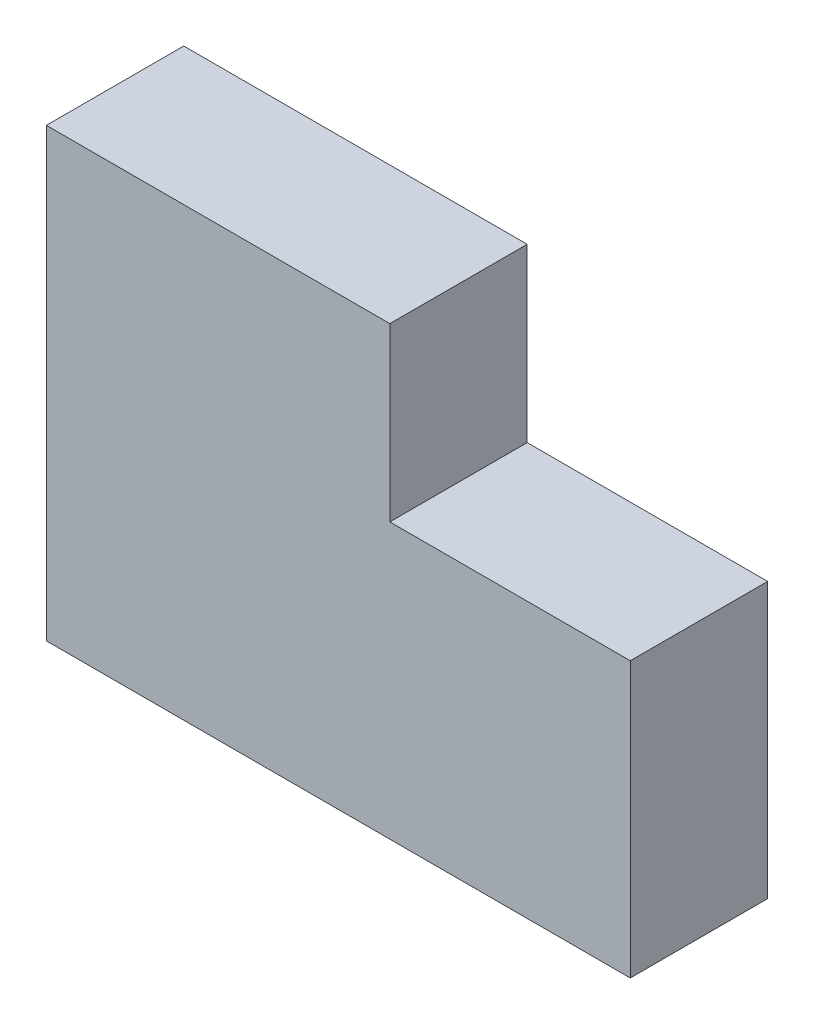
ISO-10303-21;
HEADER;
FILE_DESCRIPTION(('STEP AP214'),'2;1');
FILE_NAME('part.step','',(''),(''),'','','');
FILE_SCHEMA(('AUTOMOTIVE_DESIGN { 1 0 10303 214 1 1 1 1 }'));
ENDSEC;
DATA;
#1=APPLICATION_CONTEXT('core data for automotive mechanical design processes');
#2=APPLICATION_PROTOCOL_DEFINITION('international standard','automotive_design',2000,#1);
#3=PRODUCT_CONTEXT('',#1,'mechanical');
#4=PRODUCT('Part','Part','',(#3));
#5=PRODUCT_RELATED_PRODUCT_CATEGORY('part','',(#4));
#6=PRODUCT_DEFINITION_FORMATION('','',#4);
#7=PRODUCT_DEFINITION_CONTEXT('part definition',#1,'design');
#8=PRODUCT_DEFINITION('design','',#6,#7);
#9=PRODUCT_DEFINITION_SHAPE('','',#8);
#10=(LENGTH_UNIT() NAMED_UNIT(*) SI_UNIT(.MILLI.,.METRE.));
#11=(NAMED_UNIT(*) PLANE_ANGLE_UNIT() SI_UNIT($,.RADIAN.));
#12=(NAMED_UNIT(*) SI_UNIT($,.STERADIAN.) SOLID_ANGLE_UNIT());
#13=UNCERTAINTY_MEASURE_WITH_UNIT(LENGTH_MEASURE(1.E-05),#10,'distance_accuracy_value','');
#14=(GEOMETRIC_REPRESENTATION_CONTEXT(3) GLOBAL_UNCERTAINTY_ASSIGNED_CONTEXT((#13)) GLOBAL_UNIT_ASSIGNED_CONTEXT((#10,
#11,#12)) REPRESENTATION_CONTEXT('',''));
#15=CARTESIAN_POINT('',(0.,0.,0.));
#16=DIRECTION('',(0.,0.,1.));
#17=DIRECTION('',(1.,0.,0.));
#18=AXIS2_PLACEMENT_3D('',#15,#16,#17);
#19=CARTESIAN_POINT('',(85.,0.,-20.));
#20=DIRECTION('',(0.,-1.,0.));
#21=DIRECTION('',(0.,0.,-1.));
#22=AXIS2_PLACEMENT_3D('',#19,#20,#21);
#23=PLANE('',#22);
#24=DIRECTION('',(1.,0.,0.));
#25=VECTOR('',#24,1.);
#26=CARTESIAN_POINT('',(85.,0.,0.));
#27=LINE('',#26,#25);
#28=CARTESIAN_POINT('',(0.,0.,0.));
#29=VERTEX_POINT('',#28);
#30=CARTESIAN_POINT('',(85.,0.,0.));
#31=VERTEX_POINT('',#30);
#32=EDGE_CURVE('E130',#29,#31,#27,.T.);
#33=ORIENTED_EDGE('',*,*,#32,.F.);
#34=DIRECTION('',(0.,0.,1.));
#35=VECTOR('',#34,1.);
#36=CARTESIAN_POINT('',(0.,0.,-20.));
#37=LINE('',#36,#35);
#38=CARTESIAN_POINT('',(0.,0.,-20.));
#39=VERTEX_POINT('',#38);
#40=EDGE_CURVE('E11',#39,#29,#37,.T.);
#41=ORIENTED_EDGE('',*,*,#40,.F.);
#42=DIRECTION('',(1.,0.,0.));
#43=VECTOR('',#42,1.);
#44=CARTESIAN_POINT('',(85.,0.,-20.));
#45=LINE('',#44,#43);
#46=CARTESIAN_POINT('',(85.,0.,-20.));
#47=VERTEX_POINT('',#46);
#48=EDGE_CURVE('E150',#39,#47,#45,.T.);
#49=ORIENTED_EDGE('',*,*,#48,.T.);
#50=DIRECTION('',(0.,0.,1.));
#51=VECTOR('',#50,1.);
#52=CARTESIAN_POINT('',(85.,0.,-20.));
#53=LINE('',#52,#51);
#54=EDGE_CURVE('E42',#47,#31,#53,.T.);
#55=ORIENTED_EDGE('',*,*,#54,.T.);
#56=EDGE_LOOP('',(#33,#41,#49,#55));
#57=FACE_BOUND('',#56,.T.);
#58=ADVANCED_FACE('F39',(#57),#23,.T.);
#59=CARTESIAN_POINT('',(0.,0.,-20.));
#60=DIRECTION('',(-1.,0.,0.));
#61=DIRECTION('',(0.,0.,1.));
#62=AXIS2_PLACEMENT_3D('',#59,#60,#61);
#63=PLANE('',#62);
#64=DIRECTION('',(0.,-1.,0.));
#65=VECTOR('',#64,1.);
#66=CARTESIAN_POINT('',(0.,0.,0.));
#67=LINE('',#66,#65);
#68=CARTESIAN_POINT('',(0.,65.,0.));
#69=VERTEX_POINT('',#68);
#70=EDGE_CURVE('E147',#69,#29,#67,.T.);
#71=ORIENTED_EDGE('',*,*,#70,.F.);
#72=DIRECTION('',(0.,0.,1.));
#73=VECTOR('',#72,1.);
#74=CARTESIAN_POINT('',(0.,65.,-20.));
#75=LINE('',#74,#73);
#76=CARTESIAN_POINT('',(0.,65.,-20.));
#77=VERTEX_POINT('',#76);
#78=EDGE_CURVE('E49',#77,#69,#75,.T.);
#79=ORIENTED_EDGE('',*,*,#78,.F.);
#80=DIRECTION('',(0.,-1.,0.));
#81=VECTOR('',#80,1.);
#82=CARTESIAN_POINT('',(0.,0.,-20.));
#83=LINE('',#82,#81);
#84=EDGE_CURVE('E116',#77,#39,#83,.T.);
#85=ORIENTED_EDGE('',*,*,#84,.T.);
#86=ORIENTED_EDGE('',*,*,#40,.T.);
#87=EDGE_LOOP('',(#71,#79,#85,#86));
#88=FACE_BOUND('',#87,.T.);
#89=ADVANCED_FACE('F162',(#88),#63,.T.);
#90=CARTESIAN_POINT('',(0.,65.,-20.));
#91=DIRECTION('',(0.,1.,0.));
#92=DIRECTION('',(0.,0.,1.));
#93=AXIS2_PLACEMENT_3D('',#90,#91,#92);
#94=PLANE('',#93);
#95=DIRECTION('',(-1.,0.,0.));
#96=VECTOR('',#95,1.);
#97=CARTESIAN_POINT('',(0.,65.,0.));
#98=LINE('',#97,#96);
#99=CARTESIAN_POINT('',(50.,65.,0.));
#100=VERTEX_POINT('',#99);
#101=EDGE_CURVE('E102',#100,#69,#98,.T.);
#102=ORIENTED_EDGE('',*,*,#101,.F.);
#103=DIRECTION('',(0.,0.,1.));
#104=VECTOR('',#103,1.);
#105=CARTESIAN_POINT('',(50.,65.,-20.));
#106=LINE('',#105,#104);
#107=CARTESIAN_POINT('',(50.,65.,-20.));
#108=VERTEX_POINT('',#107);
#109=EDGE_CURVE('E97',#108,#100,#106,.T.);
#110=ORIENTED_EDGE('',*,*,#109,.F.);
#111=DIRECTION('',(-1.,0.,0.));
#112=VECTOR('',#111,1.);
#113=CARTESIAN_POINT('',(0.,65.,-20.));
#114=LINE('',#113,#112);
#115=EDGE_CURVE('E100',#108,#77,#114,.T.);
#116=ORIENTED_EDGE('',*,*,#115,.T.);
#117=ORIENTED_EDGE('',*,*,#78,.T.);
#118=EDGE_LOOP('',(#102,#110,#116,#117));
#119=FACE_BOUND('',#118,.T.);
#120=ADVANCED_FACE('F99',(#119),#94,.T.);
#121=CARTESIAN_POINT('',(50.,65.,-20.));
#122=DIRECTION('',(1.,0.,0.));
#123=DIRECTION('',(0.,0.,-1.));
#124=AXIS2_PLACEMENT_3D('',#121,#122,#123);
#125=PLANE('',#124);
#126=DIRECTION('',(0.,1.,0.));
#127=VECTOR('',#126,1.);
#128=CARTESIAN_POINT('',(50.,65.,0.));
#129=LINE('',#128,#127);
#130=CARTESIAN_POINT('',(50.,40.,0.));
#131=VERTEX_POINT('',#130);
#132=EDGE_CURVE('E142',#131,#100,#129,.T.);
#133=ORIENTED_EDGE('',*,*,#132,.F.);
#134=DIRECTION('',(0.,0.,1.));
#135=VECTOR('',#134,1.);
#136=CARTESIAN_POINT('',(50.,40.,-20.));
#137=LINE('',#136,#135);
#138=CARTESIAN_POINT('',(50.,40.,-20.));
#139=VERTEX_POINT('',#138);
#140=EDGE_CURVE('E108',#139,#131,#137,.T.);
#141=ORIENTED_EDGE('',*,*,#140,.F.);
#142=DIRECTION('',(0.,1.,0.));
#143=VECTOR('',#142,1.);
#144=CARTESIAN_POINT('',(50.,65.,-20.));
#145=LINE('',#144,#143);
#146=EDGE_CURVE('E114',#139,#108,#145,.T.);
#147=ORIENTED_EDGE('',*,*,#146,.T.);
#148=ORIENTED_EDGE('',*,*,#109,.T.);
#149=EDGE_LOOP('',(#133,#141,#147,#148));
#150=FACE_BOUND('',#149,.T.);
#151=ADVANCED_FACE('F119',(#150),#125,.T.);
#152=CARTESIAN_POINT('',(50.,40.,-20.));
#153=DIRECTION('',(0.,1.,0.));
#154=DIRECTION('',(0.,0.,1.));
#155=AXIS2_PLACEMENT_3D('',#152,#153,#154);
#156=PLANE('',#155);
#157=DIRECTION('',(-1.,0.,0.));
#158=VECTOR('',#157,1.);
#159=CARTESIAN_POINT('',(50.,40.,0.));
#160=LINE('',#159,#158);
#161=CARTESIAN_POINT('',(85.,40.,0.));
#162=VERTEX_POINT('',#161);
#163=EDGE_CURVE('E138',#162,#131,#160,.T.);
#164=ORIENTED_EDGE('',*,*,#163,.F.);
#165=DIRECTION('',(0.,0.,1.));
#166=VECTOR('',#165,1.);
#167=CARTESIAN_POINT('',(85.,40.,-20.));
#168=LINE('',#167,#166);
#169=CARTESIAN_POINT('',(85.,40.,-20.));
#170=VERTEX_POINT('',#169);
#171=EDGE_CURVE('E155',#170,#162,#168,.T.);
#172=ORIENTED_EDGE('',*,*,#171,.F.);
#173=DIRECTION('',(-1.,0.,0.));
#174=VECTOR('',#173,1.);
#175=CARTESIAN_POINT('',(50.,40.,-20.));
#176=LINE('',#175,#174);
#177=EDGE_CURVE('E121',#170,#139,#176,.T.);
#178=ORIENTED_EDGE('',*,*,#177,.T.);
#179=ORIENTED_EDGE('',*,*,#140,.T.);
#180=EDGE_LOOP('',(#164,#172,#178,#179));
#181=FACE_BOUND('',#180,.T.);
#182=ADVANCED_FACE('F175',(#181),#156,.T.);
#183=CARTESIAN_POINT('',(85.,40.,-20.));
#184=DIRECTION('',(1.,0.,0.));
#185=DIRECTION('',(0.,0.,-1.));
#186=AXIS2_PLACEMENT_3D('',#183,#184,#185);
#187=PLANE('',#186);
#188=DIRECTION('',(0.,1.,0.));
#189=VECTOR('',#188,1.);
#190=CARTESIAN_POINT('',(85.,40.,0.));
#191=LINE('',#190,#189);
#192=EDGE_CURVE('E134',#31,#162,#191,.T.);
#193=ORIENTED_EDGE('',*,*,#192,.F.);
#194=ORIENTED_EDGE('',*,*,#54,.F.);
#195=DIRECTION('',(0.,1.,0.));
#196=VECTOR('',#195,1.);
#197=CARTESIAN_POINT('',(85.,40.,-20.));
#198=LINE('',#197,#196);
#199=EDGE_CURVE('E124',#47,#170,#198,.T.);
#200=ORIENTED_EDGE('',*,*,#199,.T.);
#201=ORIENTED_EDGE('',*,*,#171,.T.);
#202=EDGE_LOOP('',(#193,#194,#200,#201));
#203=FACE_BOUND('',#202,.T.);
#204=ADVANCED_FACE('F159',(#203),#187,.T.);
#205=CARTESIAN_POINT('',(0.,0.,-20.));
#206=DIRECTION('',(0.,0.,-1.));
#207=DIRECTION('',(-1.,0.,0.));
#208=AXIS2_PLACEMENT_3D('',#205,#206,#207);
#209=PLANE('',#208);
#210=ORIENTED_EDGE('',*,*,#48,.F.);
#211=ORIENTED_EDGE('',*,*,#84,.F.);
#212=ORIENTED_EDGE('',*,*,#115,.F.);
#213=ORIENTED_EDGE('',*,*,#146,.F.);
#214=ORIENTED_EDGE('',*,*,#177,.F.);
#215=ORIENTED_EDGE('',*,*,#199,.F.);
#216=EDGE_LOOP('',(#210,#211,#212,#213,#214,#215));
#217=FACE_BOUND('',#216,.T.);
#218=ADVANCED_FACE('F112',(#217),#209,.T.);
#219=CARTESIAN_POINT('',(0.,0.,0.));
#220=DIRECTION('',(0.,0.,-1.));
#221=DIRECTION('',(-1.,0.,0.));
#222=AXIS2_PLACEMENT_3D('',#219,#220,#221);
#223=PLANE('',#222);
#224=ORIENTED_EDGE('',*,*,#32,.T.);
#225=ORIENTED_EDGE('',*,*,#192,.T.);
#226=ORIENTED_EDGE('',*,*,#163,.T.);
#227=ORIENTED_EDGE('',*,*,#132,.T.);
#228=ORIENTED_EDGE('',*,*,#101,.T.);
#229=ORIENTED_EDGE('',*,*,#70,.T.);
#230=EDGE_LOOP('',(#224,#225,#226,#227,#228,#229));
#231=FACE_BOUND('',#230,.T.);
#232=ADVANCED_FACE('F161',(#231),#223,.F.);
#233=CLOSED_SHELL('',(#58,#89,#120,#151,#182,#204,#218,#232));
#234=MANIFOLD_SOLID_BREP('B2',#233);
#235=ADVANCED_BREP_SHAPE_REPRESENTATION('',(#18,#234),#14);
#236=SHAPE_DEFINITION_REPRESENTATION(#9,#235);
ENDSEC;
END-ISO-10303-21;
